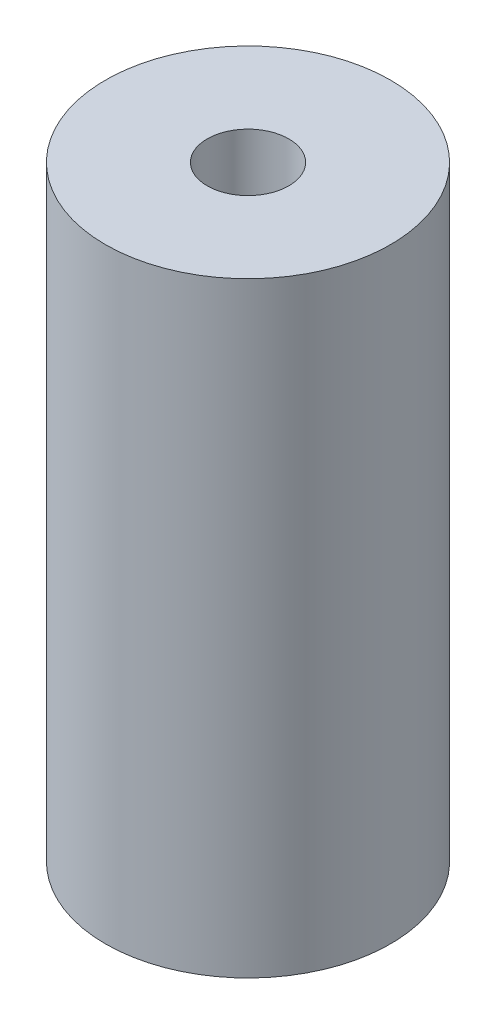
ISO-10303-21;
HEADER;
FILE_DESCRIPTION(('STEP AP214'),'2;1');
FILE_NAME('part.step','',(''),(''),'','','');
FILE_SCHEMA(('AUTOMOTIVE_DESIGN { 1 0 10303 214 1 1 1 1 }'));
ENDSEC;
DATA;
#1=APPLICATION_CONTEXT('core data for automotive mechanical design processes');
#2=APPLICATION_PROTOCOL_DEFINITION('international standard','automotive_design',2000,#1);
#3=PRODUCT_CONTEXT('',#1,'mechanical');
#4=PRODUCT('Part','Part','',(#3));
#5=PRODUCT_RELATED_PRODUCT_CATEGORY('part','',(#4));
#6=PRODUCT_DEFINITION_FORMATION('','',#4);
#7=PRODUCT_DEFINITION_CONTEXT('part definition',#1,'design');
#8=PRODUCT_DEFINITION('design','',#6,#7);
#9=PRODUCT_DEFINITION_SHAPE('','',#8);
#10=(LENGTH_UNIT() NAMED_UNIT(*) SI_UNIT(.MILLI.,.METRE.));
#11=(NAMED_UNIT(*) PLANE_ANGLE_UNIT() SI_UNIT($,.RADIAN.));
#12=(NAMED_UNIT(*) SI_UNIT($,.STERADIAN.) SOLID_ANGLE_UNIT());
#13=UNCERTAINTY_MEASURE_WITH_UNIT(LENGTH_MEASURE(1.E-05),#10,'distance_accuracy_value','');
#14=(GEOMETRIC_REPRESENTATION_CONTEXT(3) GLOBAL_UNCERTAINTY_ASSIGNED_CONTEXT((#13)) GLOBAL_UNIT_ASSIGNED_CONTEXT((#10,
#11,#12)) REPRESENTATION_CONTEXT('',''));
#15=CARTESIAN_POINT('',(0.,0.,0.));
#16=DIRECTION('',(0.,0.,1.));
#17=DIRECTION('',(1.,0.,0.));
#18=AXIS2_PLACEMENT_3D('',#15,#16,#17);
#19=CARTESIAN_POINT('',(0.,33.02,0.));
#20=DIRECTION('',(0.,1.,0.));
#21=DIRECTION('',(0.,0.,1.));
#22=AXIS2_PLACEMENT_3D('',#19,#20,#21);
#23=PLANE('',#22);
#24=CARTESIAN_POINT('',(0.,33.02,0.));
#25=DIRECTION('',(0.,1.,0.));
#26=DIRECTION('',(0.,0.,1.));
#27=AXIS2_PLACEMENT_3D('',#24,#25,#26);
#28=CIRCLE('',#27,7.7724);
#29=CARTESIAN_POINT('',(0.,33.02,7.7724));
#30=VERTEX_POINT('',#29);
#31=EDGE_CURVE('E10',#30,#30,#28,.T.);
#32=ORIENTED_EDGE('',*,*,#31,.T.);
#33=EDGE_LOOP('',(#32));
#34=FACE_BOUND('',#33,.T.);
#35=CARTESIAN_POINT('',(0.,33.02,0.));
#36=DIRECTION('',(0.,1.,0.));
#37=DIRECTION('',(0.,0.,1.));
#38=AXIS2_PLACEMENT_3D('',#35,#36,#37);
#39=CIRCLE('',#38,2.2225);
#40=CARTESIAN_POINT('',(0.,33.02,2.2225));
#41=VERTEX_POINT('',#40);
#42=EDGE_CURVE('E41',#41,#41,#39,.T.);
#43=ORIENTED_EDGE('',*,*,#42,.F.);
#44=EDGE_LOOP('',(#43));
#45=FACE_BOUND('',#44,.T.);
#46=ADVANCED_FACE('F30',(#34,#45),#23,.T.);
#47=CARTESIAN_POINT('',(0.,0.,0.));
#48=DIRECTION('',(0.,1.,0.));
#49=DIRECTION('',(0.,0.,1.));
#50=AXIS2_PLACEMENT_3D('',#47,#48,#49);
#51=PLANE('',#50);
#52=CARTESIAN_POINT('',(0.,0.,0.));
#53=DIRECTION('',(0.,1.,0.));
#54=DIRECTION('',(0.,0.,1.));
#55=AXIS2_PLACEMENT_3D('',#52,#53,#54);
#56=CIRCLE('',#55,7.7724);
#57=CARTESIAN_POINT('',(0.,0.,7.7724));
#58=VERTEX_POINT('',#57);
#59=EDGE_CURVE('E34',#58,#58,#56,.T.);
#60=ORIENTED_EDGE('',*,*,#59,.F.);
#61=EDGE_LOOP('',(#60));
#62=FACE_BOUND('',#61,.T.);
#63=CARTESIAN_POINT('',(0.,0.,0.));
#64=DIRECTION('',(0.,1.,0.));
#65=DIRECTION('',(0.,0.,1.));
#66=AXIS2_PLACEMENT_3D('',#63,#64,#65);
#67=CIRCLE('',#66,2.2225);
#68=CARTESIAN_POINT('',(0.,0.,2.2225));
#69=VERTEX_POINT('',#68);
#70=EDGE_CURVE('E43',#69,#69,#67,.T.);
#71=ORIENTED_EDGE('',*,*,#70,.T.);
#72=EDGE_LOOP('',(#71));
#73=FACE_BOUND('',#72,.T.);
#74=ADVANCED_FACE('F53',(#62,#73),#51,.F.);
#75=CARTESIAN_POINT('',(0.,33.02,0.));
#76=DIRECTION('',(0.,-1.,0.));
#77=DIRECTION('',(0.,0.,-1.));
#78=AXIS2_PLACEMENT_3D('',#75,#76,#77);
#79=CYLINDRICAL_SURFACE('',#78,7.7724);
#80=ORIENTED_EDGE('',*,*,#31,.F.);
#81=EDGE_LOOP('',(#80));
#82=FACE_BOUND('',#81,.T.);
#83=ORIENTED_EDGE('',*,*,#59,.T.);
#84=EDGE_LOOP('',(#83));
#85=FACE_BOUND('',#84,.T.);
#86=ADVANCED_FACE('F32',(#82,#85),#79,.T.);
#87=CARTESIAN_POINT('',(0.,33.02,0.));
#88=DIRECTION('',(0.,-1.,0.));
#89=DIRECTION('',(0.,0.,-1.));
#90=AXIS2_PLACEMENT_3D('',#87,#88,#89);
#91=CYLINDRICAL_SURFACE('',#90,2.2225);
#92=ORIENTED_EDGE('',*,*,#42,.T.);
#93=EDGE_LOOP('',(#92));
#94=FACE_BOUND('',#93,.T.);
#95=ORIENTED_EDGE('',*,*,#70,.F.);
#96=EDGE_LOOP('',(#95));
#97=FACE_BOUND('',#96,.T.);
#98=ADVANCED_FACE('F49',(#94,#97),#91,.F.);
#99=CLOSED_SHELL('',(#46,#74,#86,#98));
#100=MANIFOLD_SOLID_BREP('B2',#99);
#101=ADVANCED_BREP_SHAPE_REPRESENTATION('',(#18,#100),#14);
#102=SHAPE_DEFINITION_REPRESENTATION(#9,#101);
ENDSEC;
END-ISO-10303-21;
